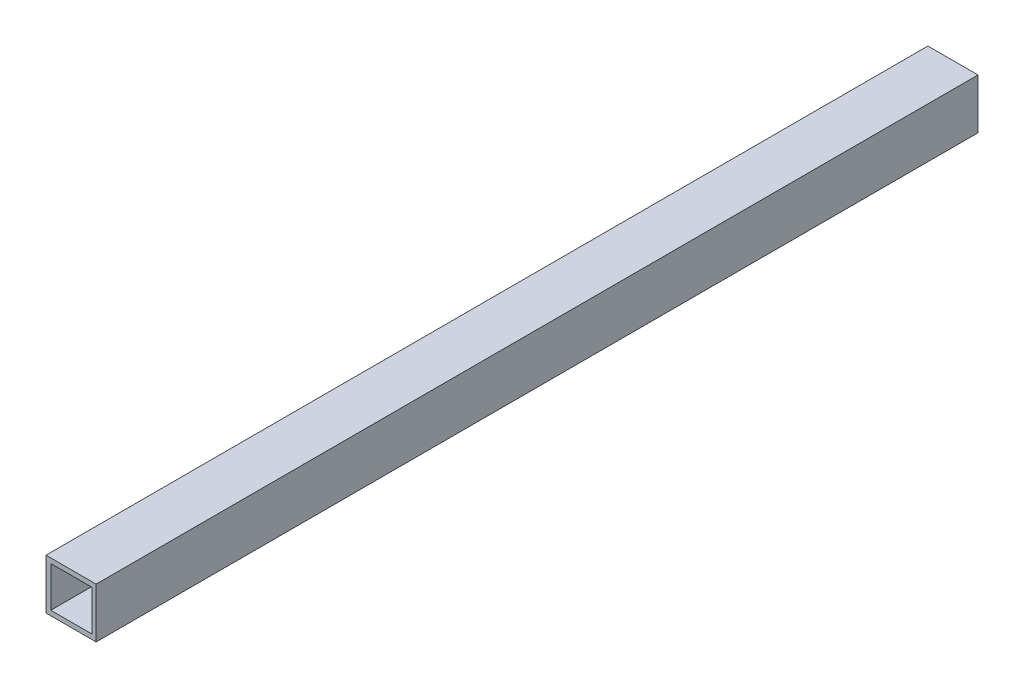
ISO-10303-21;
HEADER;
FILE_DESCRIPTION(('STEP AP214'),'2;1');
FILE_NAME('part.step','',(''),(''),'','','');
FILE_SCHEMA(('AUTOMOTIVE_DESIGN { 1 0 10303 214 1 1 1 1 }'));
ENDSEC;
DATA;
#1=APPLICATION_CONTEXT('core data for automotive mechanical design processes');
#2=APPLICATION_PROTOCOL_DEFINITION('international standard','automotive_design',2000,#1);
#3=PRODUCT_CONTEXT('',#1,'mechanical');
#4=PRODUCT('Part','Part','',(#3));
#5=PRODUCT_RELATED_PRODUCT_CATEGORY('part','',(#4));
#6=PRODUCT_DEFINITION_FORMATION('','',#4);
#7=PRODUCT_DEFINITION_CONTEXT('part definition',#1,'design');
#8=PRODUCT_DEFINITION('design','',#6,#7);
#9=PRODUCT_DEFINITION_SHAPE('','',#8);
#10=(LENGTH_UNIT() NAMED_UNIT(*) SI_UNIT(.MILLI.,.METRE.));
#11=(NAMED_UNIT(*) PLANE_ANGLE_UNIT() SI_UNIT($,.RADIAN.));
#12=(NAMED_UNIT(*) SI_UNIT($,.STERADIAN.) SOLID_ANGLE_UNIT());
#13=UNCERTAINTY_MEASURE_WITH_UNIT(LENGTH_MEASURE(1.E-05),#10,'distance_accuracy_value','');
#14=(GEOMETRIC_REPRESENTATION_CONTEXT(3) GLOBAL_UNCERTAINTY_ASSIGNED_CONTEXT((#13)) GLOBAL_UNIT_ASSIGNED_CONTEXT((#10,
#11,#12)) REPRESENTATION_CONTEXT('',''));
#15=CARTESIAN_POINT('',(0.,0.,0.));
#16=DIRECTION('',(0.,0.,1.));
#17=DIRECTION('',(1.,0.,0.));
#18=AXIS2_PLACEMENT_3D('',#15,#16,#17);
#19=CARTESIAN_POINT('',(0.,0.,279.4));
#20=DIRECTION('',(1.,0.,0.));
#21=DIRECTION('',(0.,0.,-1.));
#22=AXIS2_PLACEMENT_3D('',#19,#20,#21);
#23=PLANE('',#22);
#24=DIRECTION('',(0.,-1.,0.));
#25=VECTOR('',#24,1.);
#26=CARTESIAN_POINT('',(0.,0.,0.));
#27=LINE('',#26,#25);
#28=CARTESIAN_POINT('',(0.,15.875,0.));
#29=VERTEX_POINT('',#28);
#30=CARTESIAN_POINT('',(0.,0.,0.));
#31=VERTEX_POINT('',#30);
#32=EDGE_CURVE('E153',#29,#31,#27,.T.);
#33=ORIENTED_EDGE('',*,*,#32,.T.);
#34=DIRECTION('',(0.,0.,-1.));
#35=VECTOR('',#34,1.);
#36=CARTESIAN_POINT('',(0.,0.,279.4));
#37=LINE('',#36,#35);
#38=CARTESIAN_POINT('',(0.,0.,279.4));
#39=VERTEX_POINT('',#38);
#40=EDGE_CURVE('E11',#39,#31,#37,.T.);
#41=ORIENTED_EDGE('',*,*,#40,.F.);
#42=DIRECTION('',(0.,-1.,0.));
#43=VECTOR('',#42,1.);
#44=CARTESIAN_POINT('',(0.,0.,279.4));
#45=LINE('',#44,#43);
#46=CARTESIAN_POINT('',(0.,15.875,279.4));
#47=VERTEX_POINT('',#46);
#48=EDGE_CURVE('E159',#47,#39,#45,.T.);
#49=ORIENTED_EDGE('',*,*,#48,.F.);
#50=DIRECTION('',(0.,0.,-1.));
#51=VECTOR('',#50,1.);
#52=CARTESIAN_POINT('',(0.,15.875,279.4));
#53=LINE('',#52,#51);
#54=EDGE_CURVE('E173',#47,#29,#53,.T.);
#55=ORIENTED_EDGE('',*,*,#54,.T.);
#56=EDGE_LOOP('',(#33,#41,#49,#55));
#57=FACE_BOUND('',#56,.T.);
#58=ADVANCED_FACE('F45',(#57),#23,.F.);
#59=CARTESIAN_POINT('',(0.,0.,279.4));
#60=DIRECTION('',(0.,1.,0.));
#61=DIRECTION('',(0.,0.,1.));
#62=AXIS2_PLACEMENT_3D('',#59,#60,#61);
#63=PLANE('',#62);
#64=DIRECTION('',(1.,0.,0.));
#65=VECTOR('',#64,1.);
#66=CARTESIAN_POINT('',(0.,0.,0.));
#67=LINE('',#66,#65);
#68=CARTESIAN_POINT('',(15.875,0.,0.));
#69=VERTEX_POINT('',#68);
#70=EDGE_CURVE('E177',#31,#69,#67,.T.);
#71=ORIENTED_EDGE('',*,*,#70,.T.);
#72=DIRECTION('',(0.,0.,-1.));
#73=VECTOR('',#72,1.);
#74=CARTESIAN_POINT('',(15.875,0.,279.4));
#75=LINE('',#74,#73);
#76=CARTESIAN_POINT('',(15.875,0.,279.4));
#77=VERTEX_POINT('',#76);
#78=EDGE_CURVE('E53',#77,#69,#75,.T.);
#79=ORIENTED_EDGE('',*,*,#78,.F.);
#80=DIRECTION('',(1.,0.,0.));
#81=VECTOR('',#80,1.);
#82=CARTESIAN_POINT('',(0.,0.,279.4));
#83=LINE('',#82,#81);
#84=EDGE_CURVE('E163',#39,#77,#83,.T.);
#85=ORIENTED_EDGE('',*,*,#84,.F.);
#86=ORIENTED_EDGE('',*,*,#40,.T.);
#87=EDGE_LOOP('',(#71,#79,#85,#86));
#88=FACE_BOUND('',#87,.T.);
#89=ADVANCED_FACE('F211',(#88),#63,.F.);
#90=CARTESIAN_POINT('',(15.875,0.,279.4));
#91=DIRECTION('',(-1.,0.,0.));
#92=DIRECTION('',(0.,0.,1.));
#93=AXIS2_PLACEMENT_3D('',#90,#91,#92);
#94=PLANE('',#93);
#95=DIRECTION('',(0.,1.,0.));
#96=VECTOR('',#95,1.);
#97=CARTESIAN_POINT('',(15.875,0.,0.));
#98=LINE('',#97,#96);
#99=CARTESIAN_POINT('',(15.875,15.875,0.));
#100=VERTEX_POINT('',#99);
#101=EDGE_CURVE('E180',#69,#100,#98,.T.);
#102=ORIENTED_EDGE('',*,*,#101,.T.);
#103=DIRECTION('',(0.,0.,-1.));
#104=VECTOR('',#103,1.);
#105=CARTESIAN_POINT('',(15.875,15.875,279.4));
#106=LINE('',#105,#104);
#107=CARTESIAN_POINT('',(15.875,15.875,279.4));
#108=VERTEX_POINT('',#107);
#109=EDGE_CURVE('E188',#108,#100,#106,.T.);
#110=ORIENTED_EDGE('',*,*,#109,.F.);
#111=DIRECTION('',(0.,1.,0.));
#112=VECTOR('',#111,1.);
#113=CARTESIAN_POINT('',(15.875,0.,279.4));
#114=LINE('',#113,#112);
#115=EDGE_CURVE('E167',#77,#108,#114,.T.);
#116=ORIENTED_EDGE('',*,*,#115,.F.);
#117=ORIENTED_EDGE('',*,*,#78,.T.);
#118=EDGE_LOOP('',(#102,#110,#116,#117));
#119=FACE_BOUND('',#118,.T.);
#120=ADVANCED_FACE('F197',(#119),#94,.F.);
#121=CARTESIAN_POINT('',(0.,15.875,279.4));
#122=DIRECTION('',(0.,-1.,0.));
#123=DIRECTION('',(0.,0.,-1.));
#124=AXIS2_PLACEMENT_3D('',#121,#122,#123);
#125=PLANE('',#124);
#126=DIRECTION('',(-1.,0.,0.));
#127=VECTOR('',#126,1.);
#128=CARTESIAN_POINT('',(0.,15.875,0.));
#129=LINE('',#128,#127);
#130=EDGE_CURVE('E164',#100,#29,#129,.T.);
#131=ORIENTED_EDGE('',*,*,#130,.T.);
#132=ORIENTED_EDGE('',*,*,#54,.F.);
#133=DIRECTION('',(-1.,0.,0.));
#134=VECTOR('',#133,1.);
#135=CARTESIAN_POINT('',(0.,15.875,279.4));
#136=LINE('',#135,#134);
#137=EDGE_CURVE('E170',#108,#47,#136,.T.);
#138=ORIENTED_EDGE('',*,*,#137,.F.);
#139=ORIENTED_EDGE('',*,*,#109,.T.);
#140=EDGE_LOOP('',(#131,#132,#138,#139));
#141=FACE_BOUND('',#140,.T.);
#142=ADVANCED_FACE('F204',(#141),#125,.F.);
#143=CARTESIAN_POINT('',(0.,0.,279.4));
#144=DIRECTION('',(0.,0.,-1.));
#145=DIRECTION('',(-1.,0.,0.));
#146=AXIS2_PLACEMENT_3D('',#143,#144,#145);
#147=PLANE('',#146);
#148=DIRECTION('',(1.,0.,0.));
#149=VECTOR('',#148,1.);
#150=CARTESIAN_POINT('',(1.524,1.524,279.4));
#151=LINE('',#150,#149);
#152=CARTESIAN_POINT('',(1.524,1.524,279.4));
#153=VERTEX_POINT('',#152);
#154=CARTESIAN_POINT('',(14.5923,1.524,279.4));
#155=VERTEX_POINT('',#154);
#156=EDGE_CURVE('E144',#153,#155,#151,.T.);
#157=ORIENTED_EDGE('',*,*,#156,.F.);
#158=DIRECTION('',(0.,-1.,0.));
#159=VECTOR('',#158,1.);
#160=CARTESIAN_POINT('',(1.524,14.351,279.4));
#161=LINE('',#160,#159);
#162=CARTESIAN_POINT('',(1.524,14.351,279.4));
#163=VERTEX_POINT('',#162);
#164=EDGE_CURVE('E60',#163,#153,#161,.T.);
#165=ORIENTED_EDGE('',*,*,#164,.F.);
#166=DIRECTION('',(-1.,0.,0.));
#167=VECTOR('',#166,1.);
#168=CARTESIAN_POINT('',(1.524,14.351,279.4));
#169=LINE('',#168,#167);
#170=CARTESIAN_POINT('',(14.5923,14.351,279.4));
#171=VERTEX_POINT('',#170);
#172=EDGE_CURVE('E131',#171,#163,#169,.T.);
#173=ORIENTED_EDGE('',*,*,#172,.F.);
#174=DIRECTION('',(0.,1.,0.));
#175=VECTOR('',#174,1.);
#176=CARTESIAN_POINT('',(14.5923,14.351,279.4));
#177=LINE('',#176,#175);
#178=EDGE_CURVE('E135',#155,#171,#177,.T.);
#179=ORIENTED_EDGE('',*,*,#178,.F.);
#180=EDGE_LOOP('',(#157,#165,#173,#179));
#181=FACE_BOUND('',#180,.T.);
#182=ORIENTED_EDGE('',*,*,#48,.T.);
#183=ORIENTED_EDGE('',*,*,#84,.T.);
#184=ORIENTED_EDGE('',*,*,#115,.T.);
#185=ORIENTED_EDGE('',*,*,#137,.T.);
#186=EDGE_LOOP('',(#182,#183,#184,#185));
#187=FACE_BOUND('',#186,.T.);
#188=ADVANCED_FACE('F210',(#181,#187),#147,.F.);
#189=CARTESIAN_POINT('',(0.,0.,0.));
#190=DIRECTION('',(0.,0.,-1.));
#191=DIRECTION('',(-1.,0.,0.));
#192=AXIS2_PLACEMENT_3D('',#189,#190,#191);
#193=PLANE('',#192);
#194=DIRECTION('',(0.,-1.,0.));
#195=VECTOR('',#194,1.);
#196=CARTESIAN_POINT('',(1.524,14.351,0.));
#197=LINE('',#196,#195);
#198=CARTESIAN_POINT('',(1.524,14.351,0.));
#199=VERTEX_POINT('',#198);
#200=CARTESIAN_POINT('',(1.524,1.524,0.));
#201=VERTEX_POINT('',#200);
#202=EDGE_CURVE('E112',#199,#201,#197,.T.);
#203=ORIENTED_EDGE('',*,*,#202,.T.);
#204=DIRECTION('',(1.,0.,0.));
#205=VECTOR('',#204,1.);
#206=CARTESIAN_POINT('',(1.524,1.524,0.));
#207=LINE('',#206,#205);
#208=CARTESIAN_POINT('',(14.5923,1.524,0.));
#209=VERTEX_POINT('',#208);
#210=EDGE_CURVE('E122',#201,#209,#207,.T.);
#211=ORIENTED_EDGE('',*,*,#210,.T.);
#212=DIRECTION('',(0.,1.,0.));
#213=VECTOR('',#212,1.);
#214=CARTESIAN_POINT('',(14.5923,14.351,0.));
#215=LINE('',#214,#213);
#216=CARTESIAN_POINT('',(14.5923,14.351,0.));
#217=VERTEX_POINT('',#216);
#218=EDGE_CURVE('E68',#209,#217,#215,.T.);
#219=ORIENTED_EDGE('',*,*,#218,.T.);
#220=DIRECTION('',(-1.,0.,0.));
#221=VECTOR('',#220,1.);
#222=CARTESIAN_POINT('',(1.524,14.351,0.));
#223=LINE('',#222,#221);
#224=EDGE_CURVE('E119',#217,#199,#223,.T.);
#225=ORIENTED_EDGE('',*,*,#224,.T.);
#226=EDGE_LOOP('',(#203,#211,#219,#225));
#227=FACE_BOUND('',#226,.T.);
#228=ORIENTED_EDGE('',*,*,#32,.F.);
#229=ORIENTED_EDGE('',*,*,#130,.F.);
#230=ORIENTED_EDGE('',*,*,#101,.F.);
#231=ORIENTED_EDGE('',*,*,#70,.F.);
#232=EDGE_LOOP('',(#228,#229,#230,#231));
#233=FACE_BOUND('',#232,.T.);
#234=ADVANCED_FACE('F127',(#227,#233),#193,.T.);
#235=CARTESIAN_POINT('',(1.524,14.351,0.));
#236=DIRECTION('',(-1.,0.,0.));
#237=DIRECTION('',(0.,-1.,0.));
#238=AXIS2_PLACEMENT_3D('',#235,#236,#237);
#239=PLANE('',#238);
#240=ORIENTED_EDGE('',*,*,#164,.T.);
#241=DIRECTION('',(0.,0.,1.));
#242=VECTOR('',#241,1.);
#243=CARTESIAN_POINT('',(1.524,1.524,0.));
#244=LINE('',#243,#242);
#245=EDGE_CURVE('E108',#201,#153,#244,.T.);
#246=ORIENTED_EDGE('',*,*,#245,.F.);
#247=ORIENTED_EDGE('',*,*,#202,.F.);
#248=DIRECTION('',(0.,0.,1.));
#249=VECTOR('',#248,1.);
#250=CARTESIAN_POINT('',(1.524,14.351,0.));
#251=LINE('',#250,#249);
#252=EDGE_CURVE('E150',#199,#163,#251,.T.);
#253=ORIENTED_EDGE('',*,*,#252,.T.);
#254=EDGE_LOOP('',(#240,#246,#247,#253));
#255=FACE_BOUND('',#254,.T.);
#256=ADVANCED_FACE('F110',(#255),#239,.F.);
#257=CARTESIAN_POINT('',(1.524,14.351,0.));
#258=DIRECTION('',(0.,1.,0.));
#259=DIRECTION('',(0.,0.,1.));
#260=AXIS2_PLACEMENT_3D('',#257,#258,#259);
#261=PLANE('',#260);
#262=ORIENTED_EDGE('',*,*,#172,.T.);
#263=ORIENTED_EDGE('',*,*,#252,.F.);
#264=ORIENTED_EDGE('',*,*,#224,.F.);
#265=DIRECTION('',(0.,0.,1.));
#266=VECTOR('',#265,1.);
#267=CARTESIAN_POINT('',(14.5923,14.351,0.));
#268=LINE('',#267,#266);
#269=EDGE_CURVE('E154',#217,#171,#268,.T.);
#270=ORIENTED_EDGE('',*,*,#269,.T.);
#271=EDGE_LOOP('',(#262,#263,#264,#270));
#272=FACE_BOUND('',#271,.T.);
#273=ADVANCED_FACE('F228',(#272),#261,.F.);
#274=CARTESIAN_POINT('',(14.5923,14.351,0.));
#275=DIRECTION('',(1.,0.,0.));
#276=DIRECTION('',(0.,1.,0.));
#277=AXIS2_PLACEMENT_3D('',#274,#275,#276);
#278=PLANE('',#277);
#279=ORIENTED_EDGE('',*,*,#178,.T.);
#280=ORIENTED_EDGE('',*,*,#269,.F.);
#281=ORIENTED_EDGE('',*,*,#218,.F.);
#282=DIRECTION('',(0.,0.,1.));
#283=VECTOR('',#282,1.);
#284=CARTESIAN_POINT('',(14.5923,1.524,0.));
#285=LINE('',#284,#283);
#286=EDGE_CURVE('E118',#209,#155,#285,.T.);
#287=ORIENTED_EDGE('',*,*,#286,.T.);
#288=EDGE_LOOP('',(#279,#280,#281,#287));
#289=FACE_BOUND('',#288,.T.);
#290=ADVANCED_FACE('F231',(#289),#278,.F.);
#291=CARTESIAN_POINT('',(1.524,1.524,0.));
#292=DIRECTION('',(0.,-1.,0.));
#293=DIRECTION('',(1.,0.,0.));
#294=AXIS2_PLACEMENT_3D('',#291,#292,#293);
#295=PLANE('',#294);
#296=ORIENTED_EDGE('',*,*,#156,.T.);
#297=ORIENTED_EDGE('',*,*,#286,.F.);
#298=ORIENTED_EDGE('',*,*,#210,.F.);
#299=ORIENTED_EDGE('',*,*,#245,.T.);
#300=EDGE_LOOP('',(#296,#297,#298,#299));
#301=FACE_BOUND('',#300,.T.);
#302=ADVANCED_FACE('F123',(#301),#295,.F.);
#303=CLOSED_SHELL('',(#58,#89,#120,#142,#188,#234,#256,#273,#290,#302));
#304=MANIFOLD_SOLID_BREP('B2',#303);
#305=ADVANCED_BREP_SHAPE_REPRESENTATION('',(#18,#304),#14);
#306=SHAPE_DEFINITION_REPRESENTATION(#9,#305);
ENDSEC;
END-ISO-10303-21;
